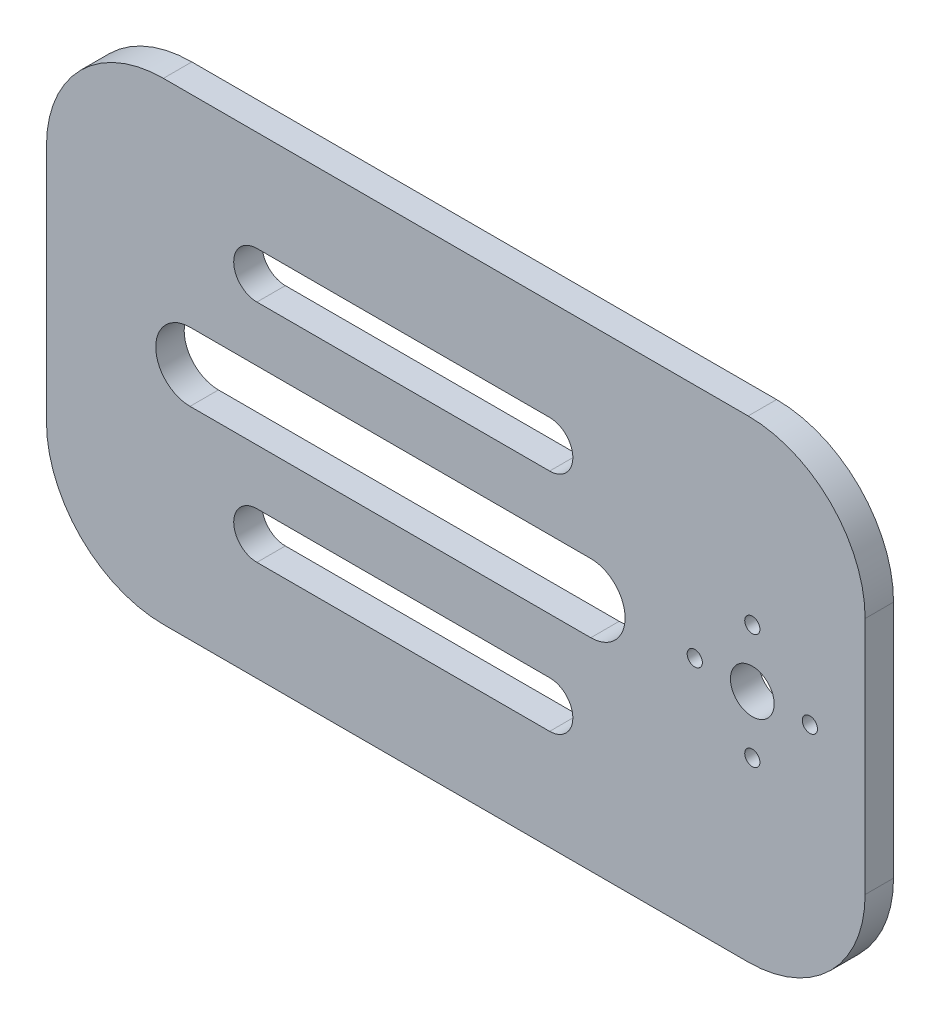
ISO-10303-21;
HEADER;
FILE_DESCRIPTION(('STEP AP214'),'2;1');
FILE_NAME('part.step','',(''),(''),'','','');
FILE_SCHEMA(('AUTOMOTIVE_DESIGN { 1 0 10303 214 1 1 1 1 }'));
ENDSEC;
DATA;
#1=APPLICATION_CONTEXT('core data for automotive mechanical design processes');
#2=APPLICATION_PROTOCOL_DEFINITION('international standard','automotive_design',2000,#1);
#3=PRODUCT_CONTEXT('',#1,'mechanical');
#4=PRODUCT('Part','Part','',(#3));
#5=PRODUCT_RELATED_PRODUCT_CATEGORY('part','',(#4));
#6=PRODUCT_DEFINITION_FORMATION('','',#4);
#7=PRODUCT_DEFINITION_CONTEXT('part definition',#1,'design');
#8=PRODUCT_DEFINITION('design','',#6,#7);
#9=PRODUCT_DEFINITION_SHAPE('','',#8);
#10=(LENGTH_UNIT() NAMED_UNIT(*) SI_UNIT(.MILLI.,.METRE.));
#11=(NAMED_UNIT(*) PLANE_ANGLE_UNIT() SI_UNIT($,.RADIAN.));
#12=(NAMED_UNIT(*) SI_UNIT($,.STERADIAN.) SOLID_ANGLE_UNIT());
#13=UNCERTAINTY_MEASURE_WITH_UNIT(LENGTH_MEASURE(1.E-05),#10,'distance_accuracy_value','');
#14=(GEOMETRIC_REPRESENTATION_CONTEXT(3) GLOBAL_UNCERTAINTY_ASSIGNED_CONTEXT((#13)) GLOBAL_UNIT_ASSIGNED_CONTEXT((#10,
#11,#12)) REPRESENTATION_CONTEXT('',''));
#15=CARTESIAN_POINT('',(0.,0.,0.));
#16=DIRECTION('',(0.,0.,1.));
#17=DIRECTION('',(1.,0.,0.));
#18=AXIS2_PLACEMENT_3D('',#15,#16,#17);
#19=CARTESIAN_POINT('',(-0.900000000000144,-25.9588,6.1722));
#20=DIRECTION('',(0.,0.,1.));
#21=DIRECTION('',(1.,0.,0.));
#22=AXIS2_PLACEMENT_3D('',#19,#20,#21);
#23=PLANE('',#22);
#24=CARTESIAN_POINT('',(-35.0805468458797,0.,6.1722));
#25=DIRECTION('',(0.,0.,-1.));
#26=DIRECTION('',(-1.,0.,0.));
#27=AXIS2_PLACEMENT_3D('',#24,#25,#26);
#28=CIRCLE('',#27,7.44220000000002);
#29=CARTESIAN_POINT('',(-35.0805468458797,7.44220000000002,6.1722));
#30=VERTEX_POINT('',#29);
#31=CARTESIAN_POINT('',(-35.0805468458797,-7.44220000000002,6.1722));
#32=VERTEX_POINT('',#31);
#33=EDGE_CURVE('E172',#30,#32,#28,.T.);
#34=ORIENTED_EDGE('',*,*,#33,.T.);
#35=DIRECTION('',(-1.,0.,0.));
#36=VECTOR('',#35,1.);
#37=CARTESIAN_POINT('',(-35.0805468458797,-7.44220000000002,6.1722));
#38=LINE('',#37,#36);
#39=CARTESIAN_POINT('',(-122.11835315412,-7.44220000000002,6.1722));
#40=VERTEX_POINT('',#39);
#41=EDGE_CURVE('E181',#32,#40,#38,.T.);
#42=ORIENTED_EDGE('',*,*,#41,.T.);
#43=CARTESIAN_POINT('',(-122.11835315412,0.,6.1722));
#44=DIRECTION('',(0.,0.,-1.));
#45=DIRECTION('',(-1.,0.,0.));
#46=AXIS2_PLACEMENT_3D('',#43,#44,#45);
#47=CIRCLE('',#46,7.44220000000002);
#48=CARTESIAN_POINT('',(-122.11835315412,7.44220000000002,6.1722));
#49=VERTEX_POINT('',#48);
#50=EDGE_CURVE('E48',#40,#49,#47,.T.);
#51=ORIENTED_EDGE('',*,*,#50,.T.);
#52=DIRECTION('',(1.,0.,0.));
#53=VECTOR('',#52,1.);
#54=CARTESIAN_POINT('',(-35.0805468458797,7.44220000000002,6.1722));
#55=LINE('',#54,#53);
#56=EDGE_CURVE('E178',#49,#30,#55,.T.);
#57=ORIENTED_EDGE('',*,*,#56,.T.);
#58=EDGE_LOOP('',(#34,#42,#51,#57));
#59=FACE_BOUND('',#58,.T.);
#60=CARTESIAN_POINT('',(-44.0193484229399,-24.47925,6.1722));
#61=DIRECTION('',(0.,0.,-1.));
#62=DIRECTION('',(-1.,0.,0.));
#63=AXIS2_PLACEMENT_3D('',#60,#61,#62);
#64=CIRCLE('',#63,5.04189999999999);
#65=CARTESIAN_POINT('',(-44.0193484229399,-19.43735,6.1722));
#66=VERTEX_POINT('',#65);
#67=CARTESIAN_POINT('',(-44.0193484229399,-29.52115,6.1722));
#68=VERTEX_POINT('',#67);
#69=EDGE_CURVE('E206',#66,#68,#64,.T.);
#70=ORIENTED_EDGE('',*,*,#69,.T.);
#71=DIRECTION('',(-1.,0.,0.));
#72=VECTOR('',#71,1.);
#73=CARTESIAN_POINT('',(-44.0193484229399,-29.52115,6.1722));
#74=LINE('',#73,#72);
#75=CARTESIAN_POINT('',(-107.59155157706,-29.52115,6.1722));
#76=VERTEX_POINT('',#75);
#77=EDGE_CURVE('E209',#68,#76,#74,.T.);
#78=ORIENTED_EDGE('',*,*,#77,.T.);
#79=CARTESIAN_POINT('',(-107.59155157706,-24.47925,6.1722));
#80=DIRECTION('',(0.,0.,-1.));
#81=DIRECTION('',(-1.,0.,0.));
#82=AXIS2_PLACEMENT_3D('',#79,#80,#81);
#83=CIRCLE('',#82,5.0419);
#84=CARTESIAN_POINT('',(-107.59155157706,-19.43735,6.1722));
#85=VERTEX_POINT('',#84);
#86=EDGE_CURVE('E213',#76,#85,#83,.T.);
#87=ORIENTED_EDGE('',*,*,#86,.T.);
#88=DIRECTION('',(1.,0.,0.));
#89=VECTOR('',#88,1.);
#90=CARTESIAN_POINT('',(-44.0193484229399,-19.43735,6.1722));
#91=LINE('',#90,#89);
#92=EDGE_CURVE('E216',#85,#66,#91,.T.);
#93=ORIENTED_EDGE('',*,*,#92,.T.);
#94=EDGE_LOOP('',(#70,#78,#87,#93));
#95=FACE_BOUND('',#94,.T.);
#96=CARTESIAN_POINT('',(-44.0193484229399,24.47925,6.1722));
#97=DIRECTION('',(0.,0.,-1.));
#98=DIRECTION('',(-1.,0.,0.));
#99=AXIS2_PLACEMENT_3D('',#96,#97,#98);
#100=CIRCLE('',#99,5.04189999999999);
#101=CARTESIAN_POINT('',(-44.0193484229399,29.52115,6.1722));
#102=VERTEX_POINT('',#101);
#103=CARTESIAN_POINT('',(-44.0193484229399,19.43735,6.1722));
#104=VERTEX_POINT('',#103);
#105=EDGE_CURVE('E238',#102,#104,#100,.T.);
#106=ORIENTED_EDGE('',*,*,#105,.T.);
#107=DIRECTION('',(-1.,0.,0.));
#108=VECTOR('',#107,1.);
#109=CARTESIAN_POINT('',(-44.0193484229399,19.43735,6.1722));
#110=LINE('',#109,#108);
#111=CARTESIAN_POINT('',(-107.59155157706,19.43735,6.1722));
#112=VERTEX_POINT('',#111);
#113=EDGE_CURVE('E241',#104,#112,#110,.T.);
#114=ORIENTED_EDGE('',*,*,#113,.T.);
#115=CARTESIAN_POINT('',(-107.59155157706,24.47925,6.1722));
#116=DIRECTION('',(0.,0.,-1.));
#117=DIRECTION('',(-1.,0.,0.));
#118=AXIS2_PLACEMENT_3D('',#115,#116,#117);
#119=CIRCLE('',#118,5.04189999999999);
#120=CARTESIAN_POINT('',(-107.59155157706,29.52115,6.1722));
#121=VERTEX_POINT('',#120);
#122=EDGE_CURVE('E245',#112,#121,#119,.T.);
#123=ORIENTED_EDGE('',*,*,#122,.T.);
#124=DIRECTION('',(1.,0.,0.));
#125=VECTOR('',#124,1.);
#126=CARTESIAN_POINT('',(-44.0193484229399,29.52115,6.1722));
#127=LINE('',#126,#125);
#128=EDGE_CURVE('E248',#121,#102,#127,.T.);
#129=ORIENTED_EDGE('',*,*,#128,.T.);
#130=EDGE_LOOP('',(#106,#114,#123,#129));
#131=FACE_BOUND('',#130,.T.);
#132=CARTESIAN_POINT('',(-12.5,-1.33765366992326E-13,6.1722));
#133=DIRECTION('',(0.,0.,1.));
#134=DIRECTION('',(1.,0.,0.));
#135=AXIS2_PLACEMENT_3D('',#132,#133,#134);
#136=CIRCLE('',#135,1.64999999999991);
#137=CARTESIAN_POINT('',(-10.8500000000001,-1.33765366992326E-13,6.1722));
#138=VERTEX_POINT('',#137);
#139=EDGE_CURVE('E276',#138,#138,#136,.T.);
#140=ORIENTED_EDGE('',*,*,#139,.F.);
#141=EDGE_LOOP('',(#140));
#142=FACE_BOUND('',#141,.T.);
#143=CARTESIAN_POINT('',(0.,-12.5000000000002,6.1722));
#144=DIRECTION('',(0.,0.,1.));
#145=DIRECTION('',(1.,0.,0.));
#146=AXIS2_PLACEMENT_3D('',#143,#144,#145);
#147=CIRCLE('',#146,1.64999999999991);
#148=CARTESIAN_POINT('',(1.64999999999991,-12.5000000000002,6.1722));
#149=VERTEX_POINT('',#148);
#150=EDGE_CURVE('E288',#149,#149,#147,.T.);
#151=ORIENTED_EDGE('',*,*,#150,.F.);
#152=EDGE_LOOP('',(#151));
#153=FACE_BOUND('',#152,.T.);
#154=CARTESIAN_POINT('',(-0.900000000000144,-25.9588,6.1722));
#155=DIRECTION('',(0.,0.,1.));
#156=DIRECTION('',(1.,0.,0.));
#157=AXIS2_PLACEMENT_3D('',#154,#155,#156);
#158=CIRCLE('',#157,25.4);
#159=CARTESIAN_POINT('',(-0.900000000000324,-51.3588,6.1722));
#160=VERTEX_POINT('',#159);
#161=CARTESIAN_POINT('',(24.4999999999999,-25.9587999999998,6.1722));
#162=VERTEX_POINT('',#161);
#163=EDGE_CURVE('E300',#160,#162,#158,.T.);
#164=ORIENTED_EDGE('',*,*,#163,.T.);
#165=DIRECTION('',(0.,1.,0.));
#166=VECTOR('',#165,1.);
#167=CARTESIAN_POINT('',(24.4999999999999,-25.9587999999998,6.1722));
#168=LINE('',#167,#166);
#169=CARTESIAN_POINT('',(24.4999999999999,25.9587999999998,6.1722));
#170=VERTEX_POINT('',#169);
#171=EDGE_CURVE('E303',#162,#170,#168,.T.);
#172=ORIENTED_EDGE('',*,*,#171,.T.);
#173=CARTESIAN_POINT('',(-0.900000000000144,25.9588,6.1722));
#174=DIRECTION('',(0.,0.,1.));
#175=DIRECTION('',(1.,0.,0.));
#176=AXIS2_PLACEMENT_3D('',#173,#174,#175);
#177=CIRCLE('',#176,25.4);
#178=CARTESIAN_POINT('',(-0.900000000000324,51.3588,6.1722));
#179=VERTEX_POINT('',#178);
#180=EDGE_CURVE('E306',#170,#179,#177,.T.);
#181=ORIENTED_EDGE('',*,*,#180,.T.);
#182=DIRECTION('',(-1.,0.,0.));
#183=VECTOR('',#182,1.);
#184=CARTESIAN_POINT('',(-0.900000000000324,51.3588,6.1722));
#185=LINE('',#184,#183);
#186=CARTESIAN_POINT('',(-127.9,51.3588,6.1722));
#187=VERTEX_POINT('',#186);
#188=EDGE_CURVE('E308',#179,#187,#185,.T.);
#189=ORIENTED_EDGE('',*,*,#188,.T.);
#190=CARTESIAN_POINT('',(-127.9,25.9588,6.1722));
#191=DIRECTION('',(0.,0.,1.));
#192=DIRECTION('',(1.,0.,0.));
#193=AXIS2_PLACEMENT_3D('',#190,#191,#192);
#194=CIRCLE('',#193,25.4);
#195=CARTESIAN_POINT('',(-153.3,25.9587999999998,6.1722));
#196=VERTEX_POINT('',#195);
#197=EDGE_CURVE('E310',#187,#196,#194,.T.);
#198=ORIENTED_EDGE('',*,*,#197,.T.);
#199=DIRECTION('',(0.,-1.,0.));
#200=VECTOR('',#199,1.);
#201=CARTESIAN_POINT('',(-153.3,-25.9587999999998,6.1722));
#202=LINE('',#201,#200);
#203=CARTESIAN_POINT('',(-153.3,-25.9587999999998,6.1722));
#204=VERTEX_POINT('',#203);
#205=EDGE_CURVE('E312',#196,#204,#202,.T.);
#206=ORIENTED_EDGE('',*,*,#205,.T.);
#207=CARTESIAN_POINT('',(-127.9,-25.9588,6.1722));
#208=DIRECTION('',(0.,0.,1.));
#209=DIRECTION('',(-1.,0.,0.));
#210=AXIS2_PLACEMENT_3D('',#207,#208,#209);
#211=CIRCLE('',#210,25.4);
#212=CARTESIAN_POINT('',(-127.9,-51.3588,6.1722));
#213=VERTEX_POINT('',#212);
#214=EDGE_CURVE('E314',#204,#213,#211,.T.);
#215=ORIENTED_EDGE('',*,*,#214,.T.);
#216=DIRECTION('',(1.,0.,0.));
#217=VECTOR('',#216,1.);
#218=CARTESIAN_POINT('',(-0.900000000000324,-51.3588,6.1722));
#219=LINE('',#218,#217);
#220=EDGE_CURVE('E316',#213,#160,#219,.T.);
#221=ORIENTED_EDGE('',*,*,#220,.T.);
#222=EDGE_LOOP('',(#164,#172,#181,#189,#198,#206,#215,#221));
#223=FACE_BOUND('',#222,.T.);
#224=CARTESIAN_POINT('',(12.5,-1.67106434089069E-13,6.1722));
#225=DIRECTION('',(0.,0.,1.));
#226=DIRECTION('',(1.,0.,0.));
#227=AXIS2_PLACEMENT_3D('',#224,#225,#226);
#228=CIRCLE('',#227,1.64999999999991);
#229=CARTESIAN_POINT('',(14.1499999999999,-1.67106434089069E-13,6.1722));
#230=VERTEX_POINT('',#229);
#231=EDGE_CURVE('E294',#230,#230,#228,.T.);
#232=ORIENTED_EDGE('',*,*,#231,.F.);
#233=EDGE_LOOP('',(#232));
#234=FACE_BOUND('',#233,.T.);
#235=CARTESIAN_POINT('',(0.,-1.51201304790165E-13,6.1722));
#236=DIRECTION('',(0.,0.,1.));
#237=DIRECTION('',(1.,0.,0.));
#238=AXIS2_PLACEMENT_3D('',#235,#236,#237);
#239=CIRCLE('',#238,4.74999999999992);
#240=CARTESIAN_POINT('',(4.74999999999992,-1.51201304790165E-13,6.1722));
#241=VERTEX_POINT('',#240);
#242=EDGE_CURVE('E282',#241,#241,#239,.T.);
#243=ORIENTED_EDGE('',*,*,#242,.F.);
#244=EDGE_LOOP('',(#243));
#245=FACE_BOUND('',#244,.T.);
#246=CARTESIAN_POINT('',(0.,12.4999999999998,6.1722));
#247=DIRECTION('',(0.,0.,1.));
#248=DIRECTION('',(1.,0.,0.));
#249=AXIS2_PLACEMENT_3D('',#246,#247,#248);
#250=CIRCLE('',#249,1.64999999999991);
#251=CARTESIAN_POINT('',(1.64999999999993,12.4999999999998,6.1722));
#252=VERTEX_POINT('',#251);
#253=EDGE_CURVE('E270',#252,#252,#250,.T.);
#254=ORIENTED_EDGE('',*,*,#253,.F.);
#255=EDGE_LOOP('',(#254));
#256=FACE_BOUND('',#255,.T.);
#257=ADVANCED_FACE('F33',(#59,#95,#131,#142,#153,#223,#234,#245,#256),#23,.T.);
#258=CARTESIAN_POINT('',(-0.900000000000144,-25.9588,0.));
#259=DIRECTION('',(0.,0.,1.));
#260=DIRECTION('',(1.,0.,0.));
#261=AXIS2_PLACEMENT_3D('',#258,#259,#260);
#262=PLANE('',#261);
#263=DIRECTION('',(-1.,0.,0.));
#264=VECTOR('',#263,1.);
#265=CARTESIAN_POINT('',(-35.0805468458797,-7.44220000000002,0.));
#266=LINE('',#265,#264);
#267=CARTESIAN_POINT('',(-35.0805468458797,-7.44220000000002,0.));
#268=VERTEX_POINT('',#267);
#269=CARTESIAN_POINT('',(-122.11835315412,-7.44220000000002,0.));
#270=VERTEX_POINT('',#269);
#271=EDGE_CURVE('E196',#268,#270,#266,.T.);
#272=ORIENTED_EDGE('',*,*,#271,.F.);
#273=CARTESIAN_POINT('',(-35.0805468458797,0.,0.));
#274=DIRECTION('',(0.,0.,-1.));
#275=DIRECTION('',(-1.,0.,0.));
#276=AXIS2_PLACEMENT_3D('',#273,#274,#275);
#277=CIRCLE('',#276,7.44220000000002);
#278=CARTESIAN_POINT('',(-35.0805468458797,7.44220000000002,0.));
#279=VERTEX_POINT('',#278);
#280=EDGE_CURVE('E56',#279,#268,#277,.T.);
#281=ORIENTED_EDGE('',*,*,#280,.F.);
#282=DIRECTION('',(1.,0.,0.));
#283=VECTOR('',#282,1.);
#284=CARTESIAN_POINT('',(-35.0805468458797,7.44220000000002,0.));
#285=LINE('',#284,#283);
#286=CARTESIAN_POINT('',(-122.11835315412,7.44220000000002,0.));
#287=VERTEX_POINT('',#286);
#288=EDGE_CURVE('E187',#287,#279,#285,.T.);
#289=ORIENTED_EDGE('',*,*,#288,.F.);
#290=CARTESIAN_POINT('',(-122.11835315412,0.,0.));
#291=DIRECTION('',(0.,0.,-1.));
#292=DIRECTION('',(-1.,0.,0.));
#293=AXIS2_PLACEMENT_3D('',#290,#291,#292);
#294=CIRCLE('',#293,7.44220000000002);
#295=EDGE_CURVE('E190',#270,#287,#294,.T.);
#296=ORIENTED_EDGE('',*,*,#295,.F.);
#297=EDGE_LOOP('',(#272,#281,#289,#296));
#298=FACE_BOUND('',#297,.T.);
#299=DIRECTION('',(-1.,0.,0.));
#300=VECTOR('',#299,1.);
#301=CARTESIAN_POINT('',(-44.0193484229399,-29.52115,0.));
#302=LINE('',#301,#300);
#303=CARTESIAN_POINT('',(-44.0193484229399,-29.52115,0.));
#304=VERTEX_POINT('',#303);
#305=CARTESIAN_POINT('',(-107.59155157706,-29.52115,0.));
#306=VERTEX_POINT('',#305);
#307=EDGE_CURVE('E221',#304,#306,#302,.T.);
#308=ORIENTED_EDGE('',*,*,#307,.F.);
#309=CARTESIAN_POINT('',(-44.0193484229399,-24.47925,0.));
#310=DIRECTION('',(0.,0.,-1.));
#311=DIRECTION('',(-1.,0.,0.));
#312=AXIS2_PLACEMENT_3D('',#309,#310,#311);
#313=CIRCLE('',#312,5.04189999999999);
#314=CARTESIAN_POINT('',(-44.0193484229399,-19.43735,0.));
#315=VERTEX_POINT('',#314);
#316=EDGE_CURVE('E202',#315,#304,#313,.T.);
#317=ORIENTED_EDGE('',*,*,#316,.F.);
#318=DIRECTION('',(1.,0.,0.));
#319=VECTOR('',#318,1.);
#320=CARTESIAN_POINT('',(-44.0193484229399,-19.43735,0.));
#321=LINE('',#320,#319);
#322=CARTESIAN_POINT('',(-107.59155157706,-19.43735,0.));
#323=VERTEX_POINT('',#322);
#324=EDGE_CURVE('E210',#323,#315,#321,.T.);
#325=ORIENTED_EDGE('',*,*,#324,.F.);
#326=CARTESIAN_POINT('',(-107.59155157706,-24.47925,0.));
#327=DIRECTION('',(0.,0.,-1.));
#328=DIRECTION('',(-1.,0.,0.));
#329=AXIS2_PLACEMENT_3D('',#326,#327,#328);
#330=CIRCLE('',#329,5.0419);
#331=EDGE_CURVE('E224',#306,#323,#330,.T.);
#332=ORIENTED_EDGE('',*,*,#331,.F.);
#333=EDGE_LOOP('',(#308,#317,#325,#332));
#334=FACE_BOUND('',#333,.T.);
#335=DIRECTION('',(-1.,0.,0.));
#336=VECTOR('',#335,1.);
#337=CARTESIAN_POINT('',(-44.0193484229399,19.43735,0.));
#338=LINE('',#337,#336);
#339=CARTESIAN_POINT('',(-44.0193484229399,19.43735,0.));
#340=VERTEX_POINT('',#339);
#341=CARTESIAN_POINT('',(-107.59155157706,19.43735,0.));
#342=VERTEX_POINT('',#341);
#343=EDGE_CURVE('E253',#340,#342,#338,.T.);
#344=ORIENTED_EDGE('',*,*,#343,.F.);
#345=CARTESIAN_POINT('',(-44.0193484229399,24.47925,0.));
#346=DIRECTION('',(0.,0.,-1.));
#347=DIRECTION('',(-1.,0.,0.));
#348=AXIS2_PLACEMENT_3D('',#345,#346,#347);
#349=CIRCLE('',#348,5.04189999999999);
#350=CARTESIAN_POINT('',(-44.0193484229399,29.52115,0.));
#351=VERTEX_POINT('',#350);
#352=EDGE_CURVE('E231',#351,#340,#349,.T.);
#353=ORIENTED_EDGE('',*,*,#352,.F.);
#354=DIRECTION('',(1.,0.,0.));
#355=VECTOR('',#354,1.);
#356=CARTESIAN_POINT('',(-44.0193484229399,29.52115,0.));
#357=LINE('',#356,#355);
#358=CARTESIAN_POINT('',(-107.59155157706,29.52115,0.));
#359=VERTEX_POINT('',#358);
#360=EDGE_CURVE('E242',#359,#351,#357,.T.);
#361=ORIENTED_EDGE('',*,*,#360,.F.);
#362=CARTESIAN_POINT('',(-107.59155157706,24.47925,0.));
#363=DIRECTION('',(0.,0.,-1.));
#364=DIRECTION('',(-1.,0.,0.));
#365=AXIS2_PLACEMENT_3D('',#362,#363,#364);
#366=CIRCLE('',#365,5.04189999999999);
#367=EDGE_CURVE('E256',#342,#359,#366,.T.);
#368=ORIENTED_EDGE('',*,*,#367,.F.);
#369=EDGE_LOOP('',(#344,#353,#361,#368));
#370=FACE_BOUND('',#369,.T.);
#371=CARTESIAN_POINT('',(-12.5,-1.33765366992326E-13,0.));
#372=DIRECTION('',(0.,0.,1.));
#373=DIRECTION('',(1.,0.,0.));
#374=AXIS2_PLACEMENT_3D('',#371,#372,#373);
#375=CIRCLE('',#374,1.64999999999991);
#376=CARTESIAN_POINT('',(-10.8500000000001,-1.33765366992326E-13,0.));
#377=VERTEX_POINT('',#376);
#378=EDGE_CURVE('E273',#377,#377,#375,.T.);
#379=ORIENTED_EDGE('',*,*,#378,.T.);
#380=EDGE_LOOP('',(#379));
#381=FACE_BOUND('',#380,.T.);
#382=CARTESIAN_POINT('',(0.,-12.5000000000002,0.));
#383=DIRECTION('',(0.,0.,1.));
#384=DIRECTION('',(1.,0.,0.));
#385=AXIS2_PLACEMENT_3D('',#382,#383,#384);
#386=CIRCLE('',#385,1.64999999999991);
#387=CARTESIAN_POINT('',(1.64999999999991,-12.5000000000002,0.));
#388=VERTEX_POINT('',#387);
#389=EDGE_CURVE('E285',#388,#388,#386,.T.);
#390=ORIENTED_EDGE('',*,*,#389,.T.);
#391=EDGE_LOOP('',(#390));
#392=FACE_BOUND('',#391,.T.);
#393=CARTESIAN_POINT('',(-0.900000000000144,-25.9588,0.));
#394=DIRECTION('',(0.,0.,1.));
#395=DIRECTION('',(1.,0.,0.));
#396=AXIS2_PLACEMENT_3D('',#393,#394,#395);
#397=CIRCLE('',#396,25.4);
#398=CARTESIAN_POINT('',(-0.900000000000324,-51.3588,0.));
#399=VERTEX_POINT('',#398);
#400=CARTESIAN_POINT('',(24.4999999999999,-25.9587999999998,0.));
#401=VERTEX_POINT('',#400);
#402=EDGE_CURVE('E297',#399,#401,#397,.T.);
#403=ORIENTED_EDGE('',*,*,#402,.F.);
#404=DIRECTION('',(1.,0.,0.));
#405=VECTOR('',#404,1.);
#406=CARTESIAN_POINT('',(-0.900000000000324,-51.3588,0.));
#407=LINE('',#406,#405);
#408=CARTESIAN_POINT('',(-127.9,-51.3588,0.));
#409=VERTEX_POINT('',#408);
#410=EDGE_CURVE('E304',#409,#399,#407,.T.);
#411=ORIENTED_EDGE('',*,*,#410,.F.);
#412=CARTESIAN_POINT('',(-127.9,-25.9588,0.));
#413=DIRECTION('',(0.,0.,1.));
#414=DIRECTION('',(-1.,0.,0.));
#415=AXIS2_PLACEMENT_3D('',#412,#413,#414);
#416=CIRCLE('',#415,25.4);
#417=CARTESIAN_POINT('',(-153.3,-25.9587999999998,0.));
#418=VERTEX_POINT('',#417);
#419=EDGE_CURVE('E331',#418,#409,#416,.T.);
#420=ORIENTED_EDGE('',*,*,#419,.F.);
#421=DIRECTION('',(0.,-1.,0.));
#422=VECTOR('',#421,1.);
#423=CARTESIAN_POINT('',(-153.3,-25.9587999999998,0.));
#424=LINE('',#423,#422);
#425=CARTESIAN_POINT('',(-153.3,25.9587999999998,0.));
#426=VERTEX_POINT('',#425);
#427=EDGE_CURVE('E329',#426,#418,#424,.T.);
#428=ORIENTED_EDGE('',*,*,#427,.F.);
#429=CARTESIAN_POINT('',(-127.9,25.9588,0.));
#430=DIRECTION('',(0.,0.,1.));
#431=DIRECTION('',(1.,0.,0.));
#432=AXIS2_PLACEMENT_3D('',#429,#430,#431);
#433=CIRCLE('',#432,25.4);
#434=CARTESIAN_POINT('',(-127.9,51.3588,0.));
#435=VERTEX_POINT('',#434);
#436=EDGE_CURVE('E327',#435,#426,#433,.T.);
#437=ORIENTED_EDGE('',*,*,#436,.F.);
#438=DIRECTION('',(-1.,0.,0.));
#439=VECTOR('',#438,1.);
#440=CARTESIAN_POINT('',(-0.900000000000324,51.3588,0.));
#441=LINE('',#440,#439);
#442=CARTESIAN_POINT('',(-0.900000000000324,51.3588,0.));
#443=VERTEX_POINT('',#442);
#444=EDGE_CURVE('E325',#443,#435,#441,.T.);
#445=ORIENTED_EDGE('',*,*,#444,.F.);
#446=CARTESIAN_POINT('',(-0.900000000000144,25.9588,0.));
#447=DIRECTION('',(0.,0.,1.));
#448=DIRECTION('',(1.,0.,0.));
#449=AXIS2_PLACEMENT_3D('',#446,#447,#448);
#450=CIRCLE('',#449,25.4);
#451=CARTESIAN_POINT('',(24.4999999999999,25.9587999999998,0.));
#452=VERTEX_POINT('',#451);
#453=EDGE_CURVE('E323',#452,#443,#450,.T.);
#454=ORIENTED_EDGE('',*,*,#453,.F.);
#455=DIRECTION('',(0.,1.,0.));
#456=VECTOR('',#455,1.);
#457=CARTESIAN_POINT('',(24.4999999999999,-25.9587999999998,0.));
#458=LINE('',#457,#456);
#459=EDGE_CURVE('E321',#401,#452,#458,.T.);
#460=ORIENTED_EDGE('',*,*,#459,.F.);
#461=EDGE_LOOP('',(#403,#411,#420,#428,#437,#445,#454,#460));
#462=FACE_BOUND('',#461,.T.);
#463=CARTESIAN_POINT('',(12.5,-1.67106434089069E-13,0.));
#464=DIRECTION('',(0.,0.,1.));
#465=DIRECTION('',(1.,0.,0.));
#466=AXIS2_PLACEMENT_3D('',#463,#464,#465);
#467=CIRCLE('',#466,1.64999999999991);
#468=CARTESIAN_POINT('',(14.1499999999999,-1.67106434089069E-13,0.));
#469=VERTEX_POINT('',#468);
#470=EDGE_CURVE('E291',#469,#469,#467,.T.);
#471=ORIENTED_EDGE('',*,*,#470,.T.);
#472=EDGE_LOOP('',(#471));
#473=FACE_BOUND('',#472,.T.);
#474=CARTESIAN_POINT('',(0.,-1.51201304790165E-13,0.));
#475=DIRECTION('',(0.,0.,1.));
#476=DIRECTION('',(1.,0.,0.));
#477=AXIS2_PLACEMENT_3D('',#474,#475,#476);
#478=CIRCLE('',#477,4.74999999999992);
#479=CARTESIAN_POINT('',(4.74999999999992,-1.51201304790165E-13,0.));
#480=VERTEX_POINT('',#479);
#481=EDGE_CURVE('E279',#480,#480,#478,.T.);
#482=ORIENTED_EDGE('',*,*,#481,.T.);
#483=EDGE_LOOP('',(#482));
#484=FACE_BOUND('',#483,.T.);
#485=CARTESIAN_POINT('',(0.,12.4999999999998,0.));
#486=DIRECTION('',(0.,0.,1.));
#487=DIRECTION('',(1.,0.,0.));
#488=AXIS2_PLACEMENT_3D('',#485,#486,#487);
#489=CIRCLE('',#488,1.64999999999991);
#490=CARTESIAN_POINT('',(1.64999999999993,12.4999999999998,0.));
#491=VERTEX_POINT('',#490);
#492=EDGE_CURVE('E263',#491,#491,#489,.T.);
#493=ORIENTED_EDGE('',*,*,#492,.T.);
#494=EDGE_LOOP('',(#493));
#495=FACE_BOUND('',#494,.T.);
#496=ADVANCED_FACE('F361',(#298,#334,#370,#381,#392,#462,#473,#484,#495),#262,.F.);
#497=CARTESIAN_POINT('',(-0.900000000000144,-25.9588,6.1722));
#498=DIRECTION('',(0.,0.,-1.));
#499=DIRECTION('',(-1.,0.,0.));
#500=AXIS2_PLACEMENT_3D('',#497,#498,#499);
#501=CYLINDRICAL_SURFACE('',#500,25.4);
#502=ORIENTED_EDGE('',*,*,#402,.T.);
#503=DIRECTION('',(0.,0.,-1.));
#504=VECTOR('',#503,1.);
#505=CARTESIAN_POINT('',(24.4999999999999,-25.9587999999998,6.1722));
#506=LINE('',#505,#504);
#507=EDGE_CURVE('E11',#162,#401,#506,.T.);
#508=ORIENTED_EDGE('',*,*,#507,.F.);
#509=ORIENTED_EDGE('',*,*,#163,.F.);
#510=DIRECTION('',(0.,0.,-1.));
#511=VECTOR('',#510,1.);
#512=CARTESIAN_POINT('',(-0.900000000000324,-51.3588,6.1722));
#513=LINE('',#512,#511);
#514=EDGE_CURVE('E318',#160,#399,#513,.T.);
#515=ORIENTED_EDGE('',*,*,#514,.T.);
#516=EDGE_LOOP('',(#502,#508,#509,#515));
#517=FACE_BOUND('',#516,.T.);
#518=ADVANCED_FACE('F35',(#517),#501,.T.);
#519=CARTESIAN_POINT('',(24.4999999999999,-25.9587999999998,6.1722));
#520=DIRECTION('',(-1.,0.,0.));
#521=DIRECTION('',(0.,0.,1.));
#522=AXIS2_PLACEMENT_3D('',#519,#520,#521);
#523=PLANE('',#522);
#524=ORIENTED_EDGE('',*,*,#459,.T.);
#525=DIRECTION('',(0.,0.,-1.));
#526=VECTOR('',#525,1.);
#527=CARTESIAN_POINT('',(24.4999999999999,25.9587999999998,6.1722));
#528=LINE('',#527,#526);
#529=EDGE_CURVE('E41',#170,#452,#528,.T.);
#530=ORIENTED_EDGE('',*,*,#529,.F.);
#531=ORIENTED_EDGE('',*,*,#171,.F.);
#532=ORIENTED_EDGE('',*,*,#507,.T.);
#533=EDGE_LOOP('',(#524,#530,#531,#532));
#534=FACE_BOUND('',#533,.T.);
#535=ADVANCED_FACE('F379',(#534),#523,.F.);
#536=CARTESIAN_POINT('',(-0.900000000000144,25.9588,6.1722));
#537=DIRECTION('',(0.,0.,-1.));
#538=DIRECTION('',(-1.,0.,0.));
#539=AXIS2_PLACEMENT_3D('',#536,#537,#538);
#540=CYLINDRICAL_SURFACE('',#539,25.4);
#541=ORIENTED_EDGE('',*,*,#453,.T.);
#542=DIRECTION('',(0.,0.,-1.));
#543=VECTOR('',#542,1.);
#544=CARTESIAN_POINT('',(-0.900000000000324,51.3588,6.1722));
#545=LINE('',#544,#543);
#546=EDGE_CURVE('E348',#179,#443,#545,.T.);
#547=ORIENTED_EDGE('',*,*,#546,.F.);
#548=ORIENTED_EDGE('',*,*,#180,.F.);
#549=ORIENTED_EDGE('',*,*,#529,.T.);
#550=EDGE_LOOP('',(#541,#547,#548,#549));
#551=FACE_BOUND('',#550,.T.);
#552=ADVANCED_FACE('F355',(#551),#540,.T.);
#553=CARTESIAN_POINT('',(-0.900000000000324,51.3588,6.1722));
#554=DIRECTION('',(0.,-1.,0.));
#555=DIRECTION('',(1.,0.,0.));
#556=AXIS2_PLACEMENT_3D('',#553,#554,#555);
#557=PLANE('',#556);
#558=ORIENTED_EDGE('',*,*,#444,.T.);
#559=DIRECTION('',(0.,0.,-1.));
#560=VECTOR('',#559,1.);
#561=CARTESIAN_POINT('',(-127.9,51.3588,6.1722));
#562=LINE('',#561,#560);
#563=EDGE_CURVE('E345',#187,#435,#562,.T.);
#564=ORIENTED_EDGE('',*,*,#563,.F.);
#565=ORIENTED_EDGE('',*,*,#188,.F.);
#566=ORIENTED_EDGE('',*,*,#546,.T.);
#567=EDGE_LOOP('',(#558,#564,#565,#566));
#568=FACE_BOUND('',#567,.T.);
#569=ADVANCED_FACE('F367',(#568),#557,.F.);
#570=CARTESIAN_POINT('',(-127.9,25.9588,6.1722));
#571=DIRECTION('',(0.,0.,-1.));
#572=DIRECTION('',(-1.,0.,0.));
#573=AXIS2_PLACEMENT_3D('',#570,#571,#572);
#574=CYLINDRICAL_SURFACE('',#573,25.4);
#575=ORIENTED_EDGE('',*,*,#436,.T.);
#576=DIRECTION('',(0.,0.,-1.));
#577=VECTOR('',#576,1.);
#578=CARTESIAN_POINT('',(-153.3,25.9587999999998,6.1722));
#579=LINE('',#578,#577);
#580=EDGE_CURVE('E342',#196,#426,#579,.T.);
#581=ORIENTED_EDGE('',*,*,#580,.F.);
#582=ORIENTED_EDGE('',*,*,#197,.F.);
#583=ORIENTED_EDGE('',*,*,#563,.T.);
#584=EDGE_LOOP('',(#575,#581,#582,#583));
#585=FACE_BOUND('',#584,.T.);
#586=ADVANCED_FACE('F371',(#585),#574,.T.);
#587=CARTESIAN_POINT('',(-153.3,-25.9587999999998,6.1722));
#588=DIRECTION('',(1.,0.,0.));
#589=DIRECTION('',(0.,0.,-1.));
#590=AXIS2_PLACEMENT_3D('',#587,#588,#589);
#591=PLANE('',#590);
#592=ORIENTED_EDGE('',*,*,#427,.T.);
#593=DIRECTION('',(0.,0.,-1.));
#594=VECTOR('',#593,1.);
#595=CARTESIAN_POINT('',(-153.3,-25.9587999999998,6.1722));
#596=LINE('',#595,#594);
#597=EDGE_CURVE('E339',#204,#418,#596,.T.);
#598=ORIENTED_EDGE('',*,*,#597,.F.);
#599=ORIENTED_EDGE('',*,*,#205,.F.);
#600=ORIENTED_EDGE('',*,*,#580,.T.);
#601=EDGE_LOOP('',(#592,#598,#599,#600));
#602=FACE_BOUND('',#601,.T.);
#603=ADVANCED_FACE('F392',(#602),#591,.F.);
#604=CARTESIAN_POINT('',(-127.9,-25.9588,6.1722));
#605=DIRECTION('',(0.,0.,-1.));
#606=DIRECTION('',(-1.,0.,0.));
#607=AXIS2_PLACEMENT_3D('',#604,#605,#606);
#608=CYLINDRICAL_SURFACE('',#607,25.4);
#609=ORIENTED_EDGE('',*,*,#419,.T.);
#610=DIRECTION('',(0.,0.,-1.));
#611=VECTOR('',#610,1.);
#612=CARTESIAN_POINT('',(-127.9,-51.3588,6.1722));
#613=LINE('',#612,#611);
#614=EDGE_CURVE('E336',#213,#409,#613,.T.);
#615=ORIENTED_EDGE('',*,*,#614,.F.);
#616=ORIENTED_EDGE('',*,*,#214,.F.);
#617=ORIENTED_EDGE('',*,*,#597,.T.);
#618=EDGE_LOOP('',(#609,#615,#616,#617));
#619=FACE_BOUND('',#618,.T.);
#620=ADVANCED_FACE('F390',(#619),#608,.T.);
#621=CARTESIAN_POINT('',(-0.900000000000324,-51.3588,6.1722));
#622=DIRECTION('',(0.,1.,0.));
#623=DIRECTION('',(-1.,0.,0.));
#624=AXIS2_PLACEMENT_3D('',#621,#622,#623);
#625=PLANE('',#624);
#626=ORIENTED_EDGE('',*,*,#410,.T.);
#627=ORIENTED_EDGE('',*,*,#514,.F.);
#628=ORIENTED_EDGE('',*,*,#220,.F.);
#629=ORIENTED_EDGE('',*,*,#614,.T.);
#630=EDGE_LOOP('',(#626,#627,#628,#629));
#631=FACE_BOUND('',#630,.T.);
#632=ADVANCED_FACE('F385',(#631),#625,.F.);
#633=CARTESIAN_POINT('',(12.5,-1.67106434089069E-13,6.1722));
#634=DIRECTION('',(0.,0.,-1.));
#635=DIRECTION('',(-1.,0.,0.));
#636=AXIS2_PLACEMENT_3D('',#633,#634,#635);
#637=CYLINDRICAL_SURFACE('',#636,1.64999999999991);
#638=ORIENTED_EDGE('',*,*,#231,.T.);
#639=EDGE_LOOP('',(#638));
#640=FACE_BOUND('',#639,.T.);
#641=ORIENTED_EDGE('',*,*,#470,.F.);
#642=EDGE_LOOP('',(#641));
#643=FACE_BOUND('',#642,.T.);
#644=ADVANCED_FACE('F409',(#640,#643),#637,.F.);
#645=CARTESIAN_POINT('',(0.,-12.5000000000002,6.1722));
#646=DIRECTION('',(0.,0.,-1.));
#647=DIRECTION('',(-1.,0.,0.));
#648=AXIS2_PLACEMENT_3D('',#645,#646,#647);
#649=CYLINDRICAL_SURFACE('',#648,1.64999999999991);
#650=ORIENTED_EDGE('',*,*,#150,.T.);
#651=EDGE_LOOP('',(#650));
#652=FACE_BOUND('',#651,.T.);
#653=ORIENTED_EDGE('',*,*,#389,.F.);
#654=EDGE_LOOP('',(#653));
#655=FACE_BOUND('',#654,.T.);
#656=ADVANCED_FACE('F416',(#652,#655),#649,.F.);
#657=CARTESIAN_POINT('',(0.,-1.51201304790165E-13,6.1722));
#658=DIRECTION('',(0.,0.,-1.));
#659=DIRECTION('',(-1.,0.,0.));
#660=AXIS2_PLACEMENT_3D('',#657,#658,#659);
#661=CYLINDRICAL_SURFACE('',#660,4.74999999999992);
#662=ORIENTED_EDGE('',*,*,#242,.T.);
#663=EDGE_LOOP('',(#662));
#664=FACE_BOUND('',#663,.T.);
#665=ORIENTED_EDGE('',*,*,#481,.F.);
#666=EDGE_LOOP('',(#665));
#667=FACE_BOUND('',#666,.T.);
#668=ADVANCED_FACE('F421',(#664,#667),#661,.F.);
#669=CARTESIAN_POINT('',(-12.5,-1.33765366992326E-13,6.1722));
#670=DIRECTION('',(0.,0.,-1.));
#671=DIRECTION('',(-1.,0.,0.));
#672=AXIS2_PLACEMENT_3D('',#669,#670,#671);
#673=CYLINDRICAL_SURFACE('',#672,1.64999999999991);
#674=ORIENTED_EDGE('',*,*,#139,.T.);
#675=EDGE_LOOP('',(#674));
#676=FACE_BOUND('',#675,.T.);
#677=ORIENTED_EDGE('',*,*,#378,.F.);
#678=EDGE_LOOP('',(#677));
#679=FACE_BOUND('',#678,.T.);
#680=ADVANCED_FACE('F434',(#676,#679),#673,.F.);
#681=CARTESIAN_POINT('',(0.,12.4999999999998,6.1722));
#682=DIRECTION('',(0.,0.,-1.));
#683=DIRECTION('',(-1.,0.,0.));
#684=AXIS2_PLACEMENT_3D('',#681,#682,#683);
#685=CYLINDRICAL_SURFACE('',#684,1.64999999999991);
#686=ORIENTED_EDGE('',*,*,#253,.T.);
#687=EDGE_LOOP('',(#686));
#688=FACE_BOUND('',#687,.T.);
#689=ORIENTED_EDGE('',*,*,#492,.F.);
#690=EDGE_LOOP('',(#689));
#691=FACE_BOUND('',#690,.T.);
#692=ADVANCED_FACE('F431',(#688,#691),#685,.F.);
#693=CARTESIAN_POINT('',(-44.0193484229399,24.47925,6.1722));
#694=DIRECTION('',(0.,0.,-1.));
#695=DIRECTION('',(-1.,0.,0.));
#696=AXIS2_PLACEMENT_3D('',#693,#694,#695);
#697=CYLINDRICAL_SURFACE('',#696,5.04189999999999);
#698=ORIENTED_EDGE('',*,*,#352,.T.);
#699=DIRECTION('',(0.,0.,-1.));
#700=VECTOR('',#699,1.);
#701=CARTESIAN_POINT('',(-44.0193484229399,19.43735,6.1722));
#702=LINE('',#701,#700);
#703=EDGE_CURVE('E251',#104,#340,#702,.T.);
#704=ORIENTED_EDGE('',*,*,#703,.F.);
#705=ORIENTED_EDGE('',*,*,#105,.F.);
#706=DIRECTION('',(0.,0.,-1.));
#707=VECTOR('',#706,1.);
#708=CARTESIAN_POINT('',(-44.0193484229399,29.52115,6.1722));
#709=LINE('',#708,#707);
#710=EDGE_CURVE('E261',#102,#351,#709,.T.);
#711=ORIENTED_EDGE('',*,*,#710,.T.);
#712=EDGE_LOOP('',(#698,#704,#705,#711));
#713=FACE_BOUND('',#712,.T.);
#714=ADVANCED_FACE('F433',(#713),#697,.F.);
#715=CARTESIAN_POINT('',(-44.0193484229399,29.52115,6.1722));
#716=DIRECTION('',(0.,1.,0.));
#717=DIRECTION('',(0.,0.,1.));
#718=AXIS2_PLACEMENT_3D('',#715,#716,#717);
#719=PLANE('',#718);
#720=ORIENTED_EDGE('',*,*,#360,.T.);
#721=ORIENTED_EDGE('',*,*,#710,.F.);
#722=ORIENTED_EDGE('',*,*,#128,.F.);
#723=DIRECTION('',(0.,0.,-1.));
#724=VECTOR('',#723,1.);
#725=CARTESIAN_POINT('',(-107.59155157706,29.52115,6.1722));
#726=LINE('',#725,#724);
#727=EDGE_CURVE('E264',#121,#359,#726,.T.);
#728=ORIENTED_EDGE('',*,*,#727,.T.);
#729=EDGE_LOOP('',(#720,#721,#722,#728));
#730=FACE_BOUND('',#729,.T.);
#731=ADVANCED_FACE('F441',(#730),#719,.F.);
#732=CARTESIAN_POINT('',(-107.59155157706,24.47925,6.1722));
#733=DIRECTION('',(0.,0.,-1.));
#734=DIRECTION('',(-1.,0.,0.));
#735=AXIS2_PLACEMENT_3D('',#732,#733,#734);
#736=CYLINDRICAL_SURFACE('',#735,5.04189999999999);
#737=ORIENTED_EDGE('',*,*,#367,.T.);
#738=ORIENTED_EDGE('',*,*,#727,.F.);
#739=ORIENTED_EDGE('',*,*,#122,.F.);
#740=DIRECTION('',(0.,0.,-1.));
#741=VECTOR('',#740,1.);
#742=CARTESIAN_POINT('',(-107.59155157706,19.43735,6.1722));
#743=LINE('',#742,#741);
#744=EDGE_CURVE('E266',#112,#342,#743,.T.);
#745=ORIENTED_EDGE('',*,*,#744,.T.);
#746=EDGE_LOOP('',(#737,#738,#739,#745));
#747=FACE_BOUND('',#746,.T.);
#748=ADVANCED_FACE('F494',(#747),#736,.F.);
#749=CARTESIAN_POINT('',(-44.0193484229399,19.43735,6.1722));
#750=DIRECTION('',(0.,-1.,0.));
#751=DIRECTION('',(0.,0.,-1.));
#752=AXIS2_PLACEMENT_3D('',#749,#750,#751);
#753=PLANE('',#752);
#754=ORIENTED_EDGE('',*,*,#343,.T.);
#755=ORIENTED_EDGE('',*,*,#744,.F.);
#756=ORIENTED_EDGE('',*,*,#113,.F.);
#757=ORIENTED_EDGE('',*,*,#703,.T.);
#758=EDGE_LOOP('',(#754,#755,#756,#757));
#759=FACE_BOUND('',#758,.T.);
#760=ADVANCED_FACE('F504',(#759),#753,.F.);
#761=CARTESIAN_POINT('',(-44.0193484229399,-24.47925,6.1722));
#762=DIRECTION('',(0.,0.,-1.));
#763=DIRECTION('',(-1.,0.,0.));
#764=AXIS2_PLACEMENT_3D('',#761,#762,#763);
#765=CYLINDRICAL_SURFACE('',#764,5.04189999999999);
#766=ORIENTED_EDGE('',*,*,#316,.T.);
#767=DIRECTION('',(0.,0.,-1.));
#768=VECTOR('',#767,1.);
#769=CARTESIAN_POINT('',(-44.0193484229399,-29.52115,6.1722));
#770=LINE('',#769,#768);
#771=EDGE_CURVE('E219',#68,#304,#770,.T.);
#772=ORIENTED_EDGE('',*,*,#771,.F.);
#773=ORIENTED_EDGE('',*,*,#69,.F.);
#774=DIRECTION('',(0.,0.,-1.));
#775=VECTOR('',#774,1.);
#776=CARTESIAN_POINT('',(-44.0193484229399,-19.43735,6.1722));
#777=LINE('',#776,#775);
#778=EDGE_CURVE('E229',#66,#315,#777,.T.);
#779=ORIENTED_EDGE('',*,*,#778,.T.);
#780=EDGE_LOOP('',(#766,#772,#773,#779));
#781=FACE_BOUND('',#780,.T.);
#782=ADVANCED_FACE('F514',(#781),#765,.F.);
#783=CARTESIAN_POINT('',(-44.0193484229399,-19.43735,6.1722));
#784=DIRECTION('',(0.,1.,0.));
#785=DIRECTION('',(-1.,0.,0.));
#786=AXIS2_PLACEMENT_3D('',#783,#784,#785);
#787=PLANE('',#786);
#788=ORIENTED_EDGE('',*,*,#324,.T.);
#789=ORIENTED_EDGE('',*,*,#778,.F.);
#790=ORIENTED_EDGE('',*,*,#92,.F.);
#791=DIRECTION('',(0.,0.,-1.));
#792=VECTOR('',#791,1.);
#793=CARTESIAN_POINT('',(-107.59155157706,-19.43735,6.1722));
#794=LINE('',#793,#792);
#795=EDGE_CURVE('E232',#85,#323,#794,.T.);
#796=ORIENTED_EDGE('',*,*,#795,.T.);
#797=EDGE_LOOP('',(#788,#789,#790,#796));
#798=FACE_BOUND('',#797,.T.);
#799=ADVANCED_FACE('F523',(#798),#787,.F.);
#800=CARTESIAN_POINT('',(-107.59155157706,-24.47925,6.1722));
#801=DIRECTION('',(0.,0.,-1.));
#802=DIRECTION('',(-1.,0.,0.));
#803=AXIS2_PLACEMENT_3D('',#800,#801,#802);
#804=CYLINDRICAL_SURFACE('',#803,5.0419);
#805=ORIENTED_EDGE('',*,*,#331,.T.);
#806=ORIENTED_EDGE('',*,*,#795,.F.);
#807=ORIENTED_EDGE('',*,*,#86,.F.);
#808=DIRECTION('',(0.,0.,-1.));
#809=VECTOR('',#808,1.);
#810=CARTESIAN_POINT('',(-107.59155157706,-29.52115,6.1722));
#811=LINE('',#810,#809);
#812=EDGE_CURVE('E234',#76,#306,#811,.T.);
#813=ORIENTED_EDGE('',*,*,#812,.T.);
#814=EDGE_LOOP('',(#805,#806,#807,#813));
#815=FACE_BOUND('',#814,.T.);
#816=ADVANCED_FACE('F533',(#815),#804,.F.);
#817=CARTESIAN_POINT('',(-44.0193484229399,-29.52115,6.1722));
#818=DIRECTION('',(0.,-1.,0.));
#819=DIRECTION('',(1.,0.,0.));
#820=AXIS2_PLACEMENT_3D('',#817,#818,#819);
#821=PLANE('',#820);
#822=ORIENTED_EDGE('',*,*,#307,.T.);
#823=ORIENTED_EDGE('',*,*,#812,.F.);
#824=ORIENTED_EDGE('',*,*,#77,.F.);
#825=ORIENTED_EDGE('',*,*,#771,.T.);
#826=EDGE_LOOP('',(#822,#823,#824,#825));
#827=FACE_BOUND('',#826,.T.);
#828=ADVANCED_FACE('F543',(#827),#821,.F.);
#829=CARTESIAN_POINT('',(-35.0805468458797,0.,6.1722));
#830=DIRECTION('',(0.,0.,-1.));
#831=DIRECTION('',(-1.,0.,0.));
#832=AXIS2_PLACEMENT_3D('',#829,#830,#831);
#833=CYLINDRICAL_SURFACE('',#832,7.44220000000002);
#834=ORIENTED_EDGE('',*,*,#280,.T.);
#835=DIRECTION('',(0.,0.,-1.));
#836=VECTOR('',#835,1.);
#837=CARTESIAN_POINT('',(-35.0805468458797,-7.44220000000002,6.1722));
#838=LINE('',#837,#836);
#839=EDGE_CURVE('E168',#32,#268,#838,.T.);
#840=ORIENTED_EDGE('',*,*,#839,.F.);
#841=ORIENTED_EDGE('',*,*,#33,.F.);
#842=DIRECTION('',(0.,0.,-1.));
#843=VECTOR('',#842,1.);
#844=CARTESIAN_POINT('',(-35.0805468458797,7.44220000000002,6.1722));
#845=LINE('',#844,#843);
#846=EDGE_CURVE('E200',#30,#279,#845,.T.);
#847=ORIENTED_EDGE('',*,*,#846,.T.);
#848=EDGE_LOOP('',(#834,#840,#841,#847));
#849=FACE_BOUND('',#848,.T.);
#850=ADVANCED_FACE('F170',(#849),#833,.F.);
#851=CARTESIAN_POINT('',(-35.0805468458797,7.44220000000002,6.1722));
#852=DIRECTION('',(0.,1.,0.));
#853=DIRECTION('',(0.,0.,1.));
#854=AXIS2_PLACEMENT_3D('',#851,#852,#853);
#855=PLANE('',#854);
#856=ORIENTED_EDGE('',*,*,#288,.T.);
#857=ORIENTED_EDGE('',*,*,#846,.F.);
#858=ORIENTED_EDGE('',*,*,#56,.F.);
#859=DIRECTION('',(0.,0.,-1.));
#860=VECTOR('',#859,1.);
#861=CARTESIAN_POINT('',(-122.11835315412,7.44220000000002,6.1722));
#862=LINE('',#861,#860);
#863=EDGE_CURVE('E203',#49,#287,#862,.T.);
#864=ORIENTED_EDGE('',*,*,#863,.T.);
#865=EDGE_LOOP('',(#856,#857,#858,#864));
#866=FACE_BOUND('',#865,.T.);
#867=ADVANCED_FACE('F562',(#866),#855,.F.);
#868=CARTESIAN_POINT('',(-122.11835315412,0.,6.1722));
#869=DIRECTION('',(0.,0.,-1.));
#870=DIRECTION('',(-1.,0.,0.));
#871=AXIS2_PLACEMENT_3D('',#868,#869,#870);
#872=CYLINDRICAL_SURFACE('',#871,7.44220000000002);
#873=ORIENTED_EDGE('',*,*,#295,.T.);
#874=ORIENTED_EDGE('',*,*,#863,.F.);
#875=ORIENTED_EDGE('',*,*,#50,.F.);
#876=DIRECTION('',(0.,0.,-1.));
#877=VECTOR('',#876,1.);
#878=CARTESIAN_POINT('',(-122.11835315412,-7.44220000000002,6.1722));
#879=LINE('',#878,#877);
#880=EDGE_CURVE('E177',#40,#270,#879,.T.);
#881=ORIENTED_EDGE('',*,*,#880,.T.);
#882=EDGE_LOOP('',(#873,#874,#875,#881));
#883=FACE_BOUND('',#882,.T.);
#884=ADVANCED_FACE('F571',(#883),#872,.F.);
#885=CARTESIAN_POINT('',(-35.0805468458797,-7.44220000000002,6.1722));
#886=DIRECTION('',(0.,-1.,0.));
#887=DIRECTION('',(0.,0.,-1.));
#888=AXIS2_PLACEMENT_3D('',#885,#886,#887);
#889=PLANE('',#888);
#890=ORIENTED_EDGE('',*,*,#271,.T.);
#891=ORIENTED_EDGE('',*,*,#880,.F.);
#892=ORIENTED_EDGE('',*,*,#41,.F.);
#893=ORIENTED_EDGE('',*,*,#839,.T.);
#894=EDGE_LOOP('',(#890,#891,#892,#893));
#895=FACE_BOUND('',#894,.T.);
#896=ADVANCED_FACE('F182',(#895),#889,.F.);
#897=CLOSED_SHELL('',(#257,#496,#518,#535,#552,#569,#586,#603,#620,#632,#644,#656,#668,#680,
#692,#714,#731,#748,#760,#782,#799,#816,#828,#850,#867,#884,#896));
#898=MANIFOLD_SOLID_BREP('B2',#897);
#899=ADVANCED_BREP_SHAPE_REPRESENTATION('',(#18,#898),#14);
#900=SHAPE_DEFINITION_REPRESENTATION(#9,#899);
ENDSEC;
END-ISO-10303-21;
